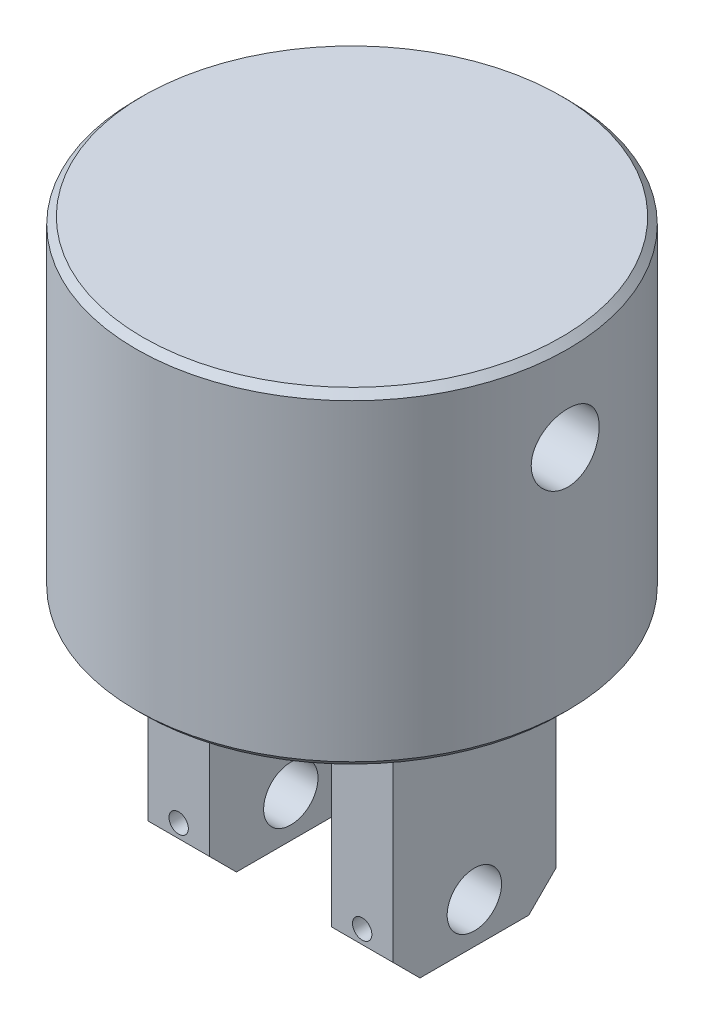
ISO-10303-21;
HEADER;
FILE_DESCRIPTION(('STEP AP214'),'2;1');
FILE_NAME('part.step','',(''),(''),'','','');
FILE_SCHEMA(('AUTOMOTIVE_DESIGN { 1 0 10303 214 1 1 1 1 }'));
ENDSEC;
DATA;
#1=APPLICATION_CONTEXT('core data for automotive mechanical design processes');
#2=APPLICATION_PROTOCOL_DEFINITION('international standard','automotive_design',2000,#1);
#3=PRODUCT_CONTEXT('',#1,'mechanical');
#4=PRODUCT('Part','Part','',(#3));
#5=PRODUCT_RELATED_PRODUCT_CATEGORY('part','',(#4));
#6=PRODUCT_DEFINITION_FORMATION('','',#4);
#7=PRODUCT_DEFINITION_CONTEXT('part definition',#1,'design');
#8=PRODUCT_DEFINITION('design','',#6,#7);
#9=PRODUCT_DEFINITION_SHAPE('','',#8);
#10=(LENGTH_UNIT() NAMED_UNIT(*) SI_UNIT(.MILLI.,.METRE.));
#11=(NAMED_UNIT(*) PLANE_ANGLE_UNIT() SI_UNIT($,.RADIAN.));
#12=(NAMED_UNIT(*) SI_UNIT($,.STERADIAN.) SOLID_ANGLE_UNIT());
#13=UNCERTAINTY_MEASURE_WITH_UNIT(LENGTH_MEASURE(1.E-05),#10,'distance_accuracy_value','');
#14=(GEOMETRIC_REPRESENTATION_CONTEXT(3) GLOBAL_UNCERTAINTY_ASSIGNED_CONTEXT((#13)) GLOBAL_UNIT_ASSIGNED_CONTEXT((#10,
#11,#12)) REPRESENTATION_CONTEXT('',''));
#15=CARTESIAN_POINT('',(0.,0.,0.));
#16=DIRECTION('',(0.,0.,1.));
#17=DIRECTION('',(1.,0.,0.));
#18=AXIS2_PLACEMENT_3D('',#15,#16,#17);
#19=CARTESIAN_POINT('',(-7.14375,15.875,19.05));
#20=DIRECTION('',(0.,1.,0.));
#21=DIRECTION('',(0.,0.,1.));
#22=AXIS2_PLACEMENT_3D('',#19,#20,#21);
#23=PLANE('',#22);
#24=DIRECTION('',(1.,0.,0.));
#25=VECTOR('',#24,1.);
#26=CARTESIAN_POINT('',(-7.14375,15.875,0.));
#27=LINE('',#26,#25);
#28=CARTESIAN_POINT('',(-7.14375,15.875,0.));
#29=VERTEX_POINT('',#28);
#30=CARTESIAN_POINT('',(7.14375,15.875,0.));
#31=VERTEX_POINT('',#30);
#32=EDGE_CURVE('E368',#29,#31,#27,.T.);
#33=ORIENTED_EDGE('',*,*,#32,.T.);
#34=DIRECTION('',(0.,0.,-1.));
#35=VECTOR('',#34,1.);
#36=CARTESIAN_POINT('',(7.14375,15.875,19.05));
#37=LINE('',#36,#35);
#38=CARTESIAN_POINT('',(7.14375,15.875,19.05));
#39=VERTEX_POINT('',#38);
#40=EDGE_CURVE('E295',#39,#31,#37,.T.);
#41=ORIENTED_EDGE('',*,*,#40,.F.);
#42=DIRECTION('',(1.,0.,0.));
#43=VECTOR('',#42,1.);
#44=CARTESIAN_POINT('',(-7.14375,15.875,19.05));
#45=LINE('',#44,#43);
#46=CARTESIAN_POINT('',(-7.14375,15.875,19.05));
#47=VERTEX_POINT('',#46);
#48=EDGE_CURVE('E381',#47,#39,#45,.T.);
#49=ORIENTED_EDGE('',*,*,#48,.F.);
#50=DIRECTION('',(0.,0.,-1.));
#51=VECTOR('',#50,1.);
#52=CARTESIAN_POINT('',(-7.14375,15.875,19.05));
#53=LINE('',#52,#51);
#54=EDGE_CURVE('E348',#47,#29,#53,.T.);
#55=ORIENTED_EDGE('',*,*,#54,.T.);
#56=EDGE_LOOP('',(#33,#41,#49,#55));
#57=FACE_BOUND('',#56,.T.);
#58=ADVANCED_FACE('F49',(#57),#23,.F.);
#59=CARTESIAN_POINT('',(7.14375,15.875,19.05));
#60=DIRECTION('',(1.,0.,0.));
#61=DIRECTION('',(0.,1.,0.));
#62=AXIS2_PLACEMENT_3D('',#59,#60,#61);
#63=PLANE('',#62);
#64=CARTESIAN_POINT('',(7.14374999999999,0.,9.525));
#65=DIRECTION('',(1.,0.,0.));
#66=DIRECTION('',(0.,1.,0.));
#67=AXIS2_PLACEMENT_3D('',#64,#65,#66);
#68=CIRCLE('',#67,3.175);
#69=CARTESIAN_POINT('',(7.14374999999999,3.175,9.525));
#70=VERTEX_POINT('',#69);
#71=EDGE_CURVE('E364',#70,#70,#68,.T.);
#72=ORIENTED_EDGE('',*,*,#71,.T.);
#73=EDGE_LOOP('',(#72));
#74=FACE_BOUND('',#73,.T.);
#75=DIRECTION('',(0.,-1.,0.));
#76=VECTOR('',#75,1.);
#77=CARTESIAN_POINT('',(7.14375,15.875,0.));
#78=LINE('',#77,#76);
#79=CARTESIAN_POINT('',(7.14375,-1.58749999999999,0.));
#80=VERTEX_POINT('',#79);
#81=EDGE_CURVE('E392',#31,#80,#78,.T.);
#82=ORIENTED_EDGE('',*,*,#81,.T.);
#83=DIRECTION('',(0.,-0.707106781186549,0.707106781186546));
#84=VECTOR('',#83,1.);
#85=CARTESIAN_POINT('',(7.14375,-4.7625,3.175));
#86=LINE('',#85,#84);
#87=CARTESIAN_POINT('',(7.14375,-4.7625,3.175));
#88=VERTEX_POINT('',#87);
#89=EDGE_CURVE('E300',#80,#88,#86,.T.);
#90=ORIENTED_EDGE('',*,*,#89,.T.);
#91=DIRECTION('',(0.,0.,-1.));
#92=VECTOR('',#91,1.);
#93=CARTESIAN_POINT('',(7.14375,-4.7625,19.05));
#94=LINE('',#93,#92);
#95=CARTESIAN_POINT('',(7.14375,-4.7625,15.875));
#96=VERTEX_POINT('',#95);
#97=EDGE_CURVE('E286',#96,#88,#94,.T.);
#98=ORIENTED_EDGE('',*,*,#97,.F.);
#99=DIRECTION('',(0.,-0.707106781186546,-0.707106781186549));
#100=VECTOR('',#99,1.);
#101=CARTESIAN_POINT('',(7.14375,-1.5875,19.05));
#102=LINE('',#101,#100);
#103=CARTESIAN_POINT('',(7.14375,-1.5875,19.05));
#104=VERTEX_POINT('',#103);
#105=EDGE_CURVE('E313',#96,#104,#102,.F.);
#106=ORIENTED_EDGE('',*,*,#105,.T.);
#107=DIRECTION('',(0.,-1.,0.));
#108=VECTOR('',#107,1.);
#109=CARTESIAN_POINT('',(7.14375,15.875,19.05));
#110=LINE('',#109,#108);
#111=EDGE_CURVE('E384',#39,#104,#110,.T.);
#112=ORIENTED_EDGE('',*,*,#111,.F.);
#113=ORIENTED_EDGE('',*,*,#40,.T.);
#114=EDGE_LOOP('',(#82,#90,#98,#106,#112,#113));
#115=FACE_BOUND('',#114,.T.);
#116=ADVANCED_FACE('F181',(#74,#115),#63,.F.);
#117=CARTESIAN_POINT('',(7.14375,-4.7625,19.05));
#118=DIRECTION('',(0.,1.,0.));
#119=DIRECTION('',(-1.,0.,0.));
#120=AXIS2_PLACEMENT_3D('',#117,#118,#119);
#121=PLANE('',#120);
#122=ORIENTED_EDGE('',*,*,#97,.T.);
#123=DIRECTION('',(1.,0.,0.));
#124=VECTOR('',#123,1.);
#125=CARTESIAN_POINT('',(14.2875,-4.7625,3.175));
#126=LINE('',#125,#124);
#127=CARTESIAN_POINT('',(14.2875,-4.7625,3.175));
#128=VERTEX_POINT('',#127);
#129=EDGE_CURVE('E289',#88,#128,#126,.T.);
#130=ORIENTED_EDGE('',*,*,#129,.T.);
#131=DIRECTION('',(0.,0.,-1.));
#132=VECTOR('',#131,1.);
#133=CARTESIAN_POINT('',(14.2875,-4.7625,19.05));
#134=LINE('',#133,#132);
#135=CARTESIAN_POINT('',(14.2875,-4.7625,15.875));
#136=VERTEX_POINT('',#135);
#137=EDGE_CURVE('E296',#136,#128,#134,.T.);
#138=ORIENTED_EDGE('',*,*,#137,.F.);
#139=DIRECTION('',(-1.,0.,0.));
#140=VECTOR('',#139,1.);
#141=CARTESIAN_POINT('',(7.14375,-4.7625,15.875));
#142=LINE('',#141,#140);
#143=EDGE_CURVE('E292',#136,#96,#142,.T.);
#144=ORIENTED_EDGE('',*,*,#143,.T.);
#145=EDGE_LOOP('',(#122,#130,#138,#144));
#146=FACE_BOUND('',#145,.T.);
#147=ADVANCED_FACE('F187',(#146),#121,.F.);
#148=CARTESIAN_POINT('',(14.2875,-4.7625,19.05));
#149=DIRECTION('',(-1.,0.,0.));
#150=DIRECTION('',(0.,-1.,0.));
#151=AXIS2_PLACEMENT_3D('',#148,#149,#150);
#152=PLANE('',#151);
#153=CARTESIAN_POINT('',(14.2875,0.,9.525));
#154=DIRECTION('',(1.,0.,0.));
#155=DIRECTION('',(0.,0.,-1.));
#156=AXIS2_PLACEMENT_3D('',#153,#154,#155);
#157=CIRCLE('',#156,3.175);
#158=CARTESIAN_POINT('',(14.2875,0.,6.35));
#159=VERTEX_POINT('',#158);
#160=EDGE_CURVE('E371',#159,#159,#157,.T.);
#161=ORIENTED_EDGE('',*,*,#160,.F.);
#162=EDGE_LOOP('',(#161));
#163=FACE_BOUND('',#162,.T.);
#164=ORIENTED_EDGE('',*,*,#137,.T.);
#165=DIRECTION('',(0.,0.707106781186549,-0.707106781186546));
#166=VECTOR('',#165,1.);
#167=CARTESIAN_POINT('',(14.2875,-4.7625,3.175));
#168=LINE('',#167,#166);
#169=CARTESIAN_POINT('',(14.2875,-1.58749999999999,0.));
#170=VERTEX_POINT('',#169);
#171=EDGE_CURVE('E301',#128,#170,#168,.T.);
#172=ORIENTED_EDGE('',*,*,#171,.T.);
#173=DIRECTION('',(0.,1.,0.));
#174=VECTOR('',#173,1.);
#175=CARTESIAN_POINT('',(14.2875,-4.7625,0.));
#176=LINE('',#175,#174);
#177=CARTESIAN_POINT('',(14.2875,23.8125,0.));
#178=VERTEX_POINT('',#177);
#179=EDGE_CURVE('E395',#170,#178,#176,.T.);
#180=ORIENTED_EDGE('',*,*,#179,.T.);
#181=DIRECTION('',(0.,0.,-1.));
#182=VECTOR('',#181,1.);
#183=CARTESIAN_POINT('',(14.2875,23.8125,19.05));
#184=LINE('',#183,#182);
#185=CARTESIAN_POINT('',(14.2875,23.8125,19.05));
#186=VERTEX_POINT('',#185);
#187=EDGE_CURVE('E357',#186,#178,#184,.T.);
#188=ORIENTED_EDGE('',*,*,#187,.F.);
#189=DIRECTION('',(0.,1.,0.));
#190=VECTOR('',#189,1.);
#191=CARTESIAN_POINT('',(14.2875,-4.7625,19.05));
#192=LINE('',#191,#190);
#193=CARTESIAN_POINT('',(14.2875,-1.5875,19.05));
#194=VERTEX_POINT('',#193);
#195=EDGE_CURVE('E387',#194,#186,#192,.T.);
#196=ORIENTED_EDGE('',*,*,#195,.F.);
#197=DIRECTION('',(0.,0.707106781186546,0.707106781186549));
#198=VECTOR('',#197,1.);
#199=CARTESIAN_POINT('',(14.2875,-1.5875,19.05));
#200=LINE('',#199,#198);
#201=EDGE_CURVE('E302',#194,#136,#200,.F.);
#202=ORIENTED_EDGE('',*,*,#201,.T.);
#203=EDGE_LOOP('',(#164,#172,#180,#188,#196,#202));
#204=FACE_BOUND('',#203,.T.);
#205=ADVANCED_FACE('F275',(#163,#204),#152,.F.);
#206=CARTESIAN_POINT('',(-14.2875,-4.7625,19.05));
#207=DIRECTION('',(1.,0.,0.));
#208=DIRECTION('',(0.,1.,0.));
#209=AXIS2_PLACEMENT_3D('',#206,#207,#208);
#210=PLANE('',#209);
#211=CARTESIAN_POINT('',(-14.2875,0.,9.525));
#212=DIRECTION('',(1.,0.,0.));
#213=DIRECTION('',(0.,0.,-1.));
#214=AXIS2_PLACEMENT_3D('',#211,#212,#213);
#215=CIRCLE('',#214,3.175);
#216=CARTESIAN_POINT('',(-14.2875,0.,6.35));
#217=VERTEX_POINT('',#216);
#218=EDGE_CURVE('E365',#217,#217,#215,.T.);
#219=ORIENTED_EDGE('',*,*,#218,.T.);
#220=EDGE_LOOP('',(#219));
#221=FACE_BOUND('',#220,.T.);
#222=DIRECTION('',(0.,-1.,0.));
#223=VECTOR('',#222,1.);
#224=CARTESIAN_POINT('',(-14.2875,-4.7625,0.));
#225=LINE('',#224,#223);
#226=CARTESIAN_POINT('',(-14.2875,23.8125,0.));
#227=VERTEX_POINT('',#226);
#228=CARTESIAN_POINT('',(-14.2875,-1.58749999999999,0.));
#229=VERTEX_POINT('',#228);
#230=EDGE_CURVE('E401',#227,#229,#225,.T.);
#231=ORIENTED_EDGE('',*,*,#230,.T.);
#232=DIRECTION('',(0.,-0.707106781186549,0.707106781186546));
#233=VECTOR('',#232,1.);
#234=CARTESIAN_POINT('',(-14.2875,-4.7625,3.175));
#235=LINE('',#234,#233);
#236=CARTESIAN_POINT('',(-14.2875,-4.7625,3.175));
#237=VERTEX_POINT('',#236);
#238=EDGE_CURVE('E68',#229,#237,#235,.T.);
#239=ORIENTED_EDGE('',*,*,#238,.T.);
#240=DIRECTION('',(0.,0.,-1.));
#241=VECTOR('',#240,1.);
#242=CARTESIAN_POINT('',(-14.2875,-4.7625,19.05));
#243=LINE('',#242,#241);
#244=CARTESIAN_POINT('',(-14.2875,-4.7625,15.875));
#245=VERTEX_POINT('',#244);
#246=EDGE_CURVE('E334',#245,#237,#243,.T.);
#247=ORIENTED_EDGE('',*,*,#246,.F.);
#248=DIRECTION('',(0.,-0.707106781186546,-0.707106781186549));
#249=VECTOR('',#248,1.);
#250=CARTESIAN_POINT('',(-14.2875,-1.5875,19.05));
#251=LINE('',#250,#249);
#252=CARTESIAN_POINT('',(-14.2875,-1.5875,19.05));
#253=VERTEX_POINT('',#252);
#254=EDGE_CURVE('E233',#245,#253,#251,.F.);
#255=ORIENTED_EDGE('',*,*,#254,.T.);
#256=DIRECTION('',(0.,-1.,0.));
#257=VECTOR('',#256,1.);
#258=CARTESIAN_POINT('',(-14.2875,-4.7625,19.05));
#259=LINE('',#258,#257);
#260=CARTESIAN_POINT('',(-14.2875,23.8125,19.05));
#261=VERTEX_POINT('',#260);
#262=EDGE_CURVE('E332',#261,#253,#259,.T.);
#263=ORIENTED_EDGE('',*,*,#262,.F.);
#264=DIRECTION('',(0.,0.,-1.));
#265=VECTOR('',#264,1.);
#266=CARTESIAN_POINT('',(-14.2875,23.8125,19.05));
#267=LINE('',#266,#265);
#268=EDGE_CURVE('E350',#261,#227,#267,.T.);
#269=ORIENTED_EDGE('',*,*,#268,.T.);
#270=EDGE_LOOP('',(#231,#239,#247,#255,#263,#269));
#271=FACE_BOUND('',#270,.T.);
#272=ADVANCED_FACE('F272',(#221,#271),#210,.F.);
#273=CARTESIAN_POINT('',(-7.14375,-4.7625,19.05));
#274=DIRECTION('',(0.,1.,0.));
#275=DIRECTION('',(-1.,0.,0.));
#276=AXIS2_PLACEMENT_3D('',#273,#274,#275);
#277=PLANE('',#276);
#278=ORIENTED_EDGE('',*,*,#246,.T.);
#279=DIRECTION('',(1.,0.,0.));
#280=VECTOR('',#279,1.);
#281=CARTESIAN_POINT('',(-7.14375,-4.7625,3.175));
#282=LINE('',#281,#280);
#283=CARTESIAN_POINT('',(-7.14375,-4.7625,3.175));
#284=VERTEX_POINT('',#283);
#285=EDGE_CURVE('E323',#237,#284,#282,.T.);
#286=ORIENTED_EDGE('',*,*,#285,.T.);
#287=DIRECTION('',(0.,0.,-1.));
#288=VECTOR('',#287,1.);
#289=CARTESIAN_POINT('',(-7.14375,-4.7625,19.05));
#290=LINE('',#289,#288);
#291=CARTESIAN_POINT('',(-7.14375,-4.7625,15.875));
#292=VERTEX_POINT('',#291);
#293=EDGE_CURVE('E345',#292,#284,#290,.T.);
#294=ORIENTED_EDGE('',*,*,#293,.F.);
#295=DIRECTION('',(-1.,0.,0.));
#296=VECTOR('',#295,1.);
#297=CARTESIAN_POINT('',(-7.14375,-4.7625,15.875));
#298=LINE('',#297,#296);
#299=EDGE_CURVE('E75',#292,#245,#298,.T.);
#300=ORIENTED_EDGE('',*,*,#299,.T.);
#301=EDGE_LOOP('',(#278,#286,#294,#300));
#302=FACE_BOUND('',#301,.T.);
#303=ADVANCED_FACE('F268',(#302),#277,.F.);
#304=CARTESIAN_POINT('',(-7.14375,15.875,19.05));
#305=DIRECTION('',(-1.,0.,0.));
#306=DIRECTION('',(0.,-1.,0.));
#307=AXIS2_PLACEMENT_3D('',#304,#305,#306);
#308=PLANE('',#307);
#309=CARTESIAN_POINT('',(-7.14375,0.,9.525));
#310=DIRECTION('',(-1.,0.,0.));
#311=DIRECTION('',(0.,-1.,0.));
#312=AXIS2_PLACEMENT_3D('',#309,#310,#311);
#313=CIRCLE('',#312,3.175);
#314=CARTESIAN_POINT('',(-7.14375,-3.175,9.525));
#315=VERTEX_POINT('',#314);
#316=EDGE_CURVE('E362',#315,#315,#313,.T.);
#317=ORIENTED_EDGE('',*,*,#316,.T.);
#318=EDGE_LOOP('',(#317));
#319=FACE_BOUND('',#318,.T.);
#320=ORIENTED_EDGE('',*,*,#293,.T.);
#321=DIRECTION('',(0.,0.707106781186549,-0.707106781186546));
#322=VECTOR('',#321,1.);
#323=CARTESIAN_POINT('',(-7.14375,-4.7625,3.175));
#324=LINE('',#323,#322);
#325=CARTESIAN_POINT('',(-7.14375,-1.58749999999999,0.));
#326=VERTEX_POINT('',#325);
#327=EDGE_CURVE('E328',#284,#326,#324,.T.);
#328=ORIENTED_EDGE('',*,*,#327,.T.);
#329=DIRECTION('',(0.,1.,0.));
#330=VECTOR('',#329,1.);
#331=CARTESIAN_POINT('',(-7.14375,15.875,0.));
#332=LINE('',#331,#330);
#333=EDGE_CURVE('E385',#326,#29,#332,.T.);
#334=ORIENTED_EDGE('',*,*,#333,.T.);
#335=ORIENTED_EDGE('',*,*,#54,.F.);
#336=DIRECTION('',(0.,1.,0.));
#337=VECTOR('',#336,1.);
#338=CARTESIAN_POINT('',(-7.14375,15.875,19.05));
#339=LINE('',#338,#337);
#340=CARTESIAN_POINT('',(-7.14375,-1.5875,19.05));
#341=VERTEX_POINT('',#340);
#342=EDGE_CURVE('E341',#341,#47,#339,.T.);
#343=ORIENTED_EDGE('',*,*,#342,.F.);
#344=DIRECTION('',(0.,0.707106781186546,0.707106781186549));
#345=VECTOR('',#344,1.);
#346=CARTESIAN_POINT('',(-7.14375,-1.5875,19.05));
#347=LINE('',#346,#345);
#348=EDGE_CURVE('E326',#341,#292,#347,.F.);
#349=ORIENTED_EDGE('',*,*,#348,.T.);
#350=EDGE_LOOP('',(#320,#328,#334,#335,#343,#349));
#351=FACE_BOUND('',#350,.T.);
#352=ADVANCED_FACE('F261',(#319,#351),#308,.F.);
#353=CARTESIAN_POINT('',(0.,0.,19.05));
#354=DIRECTION('',(0.,0.,-1.));
#355=DIRECTION('',(-1.,0.,0.));
#356=AXIS2_PLACEMENT_3D('',#353,#354,#355);
#357=PLANE('',#356);
#358=CARTESIAN_POINT('',(-10.715625,0.,19.05));
#359=DIRECTION('',(0.,0.,1.));
#360=DIRECTION('',(1.,0.,0.));
#361=AXIS2_PLACEMENT_3D('',#358,#359,#360);
#362=CIRCLE('',#361,1.1303);
#363=CARTESIAN_POINT('',(-9.585325,0.,19.05));
#364=VERTEX_POINT('',#363);
#365=EDGE_CURVE('E154',#364,#364,#362,.T.);
#366=ORIENTED_EDGE('',*,*,#365,.F.);
#367=EDGE_LOOP('',(#366));
#368=FACE_BOUND('',#367,.T.);
#369=CARTESIAN_POINT('',(10.715625,0.,19.05));
#370=DIRECTION('',(0.,0.,1.));
#371=DIRECTION('',(1.,0.,0.));
#372=AXIS2_PLACEMENT_3D('',#369,#370,#371);
#373=CIRCLE('',#372,1.1303);
#374=CARTESIAN_POINT('',(11.845925,0.,19.05));
#375=VERTEX_POINT('',#374);
#376=EDGE_CURVE('E166',#375,#375,#373,.T.);
#377=ORIENTED_EDGE('',*,*,#376,.F.);
#378=EDGE_LOOP('',(#377));
#379=FACE_BOUND('',#378,.T.);
#380=ORIENTED_EDGE('',*,*,#111,.T.);
#381=DIRECTION('',(1.,0.,0.));
#382=VECTOR('',#381,1.);
#383=CARTESIAN_POINT('',(0.,-1.5875,19.05));
#384=LINE('',#383,#382);
#385=EDGE_CURVE('E319',#104,#194,#384,.T.);
#386=ORIENTED_EDGE('',*,*,#385,.T.);
#387=ORIENTED_EDGE('',*,*,#195,.T.);
#388=DIRECTION('',(-1.,0.,0.));
#389=VECTOR('',#388,1.);
#390=CARTESIAN_POINT('',(-14.2875,23.8125,19.05));
#391=LINE('',#390,#389);
#392=EDGE_CURVE('E340',#186,#261,#391,.T.);
#393=ORIENTED_EDGE('',*,*,#392,.T.);
#394=ORIENTED_EDGE('',*,*,#262,.T.);
#395=DIRECTION('',(1.,0.,0.));
#396=VECTOR('',#395,1.);
#397=CARTESIAN_POINT('',(0.,-1.5875,19.05));
#398=LINE('',#397,#396);
#399=EDGE_CURVE('E316',#253,#341,#398,.T.);
#400=ORIENTED_EDGE('',*,*,#399,.T.);
#401=ORIENTED_EDGE('',*,*,#342,.T.);
#402=ORIENTED_EDGE('',*,*,#48,.T.);
#403=EDGE_LOOP('',(#380,#386,#387,#393,#394,#400,#401,#402));
#404=FACE_BOUND('',#403,.T.);
#405=ADVANCED_FACE('F257',(#368,#379,#404),#357,.F.);
#406=CARTESIAN_POINT('',(0.,0.,0.));
#407=DIRECTION('',(0.,0.,-1.));
#408=DIRECTION('',(-1.,0.,0.));
#409=AXIS2_PLACEMENT_3D('',#406,#407,#408);
#410=PLANE('',#409);
#411=ORIENTED_EDGE('',*,*,#179,.F.);
#412=DIRECTION('',(-1.,0.,0.));
#413=VECTOR('',#412,1.);
#414=CARTESIAN_POINT('',(7.14375,-1.58749999999999,0.));
#415=LINE('',#414,#413);
#416=EDGE_CURVE('E311',#170,#80,#415,.T.);
#417=ORIENTED_EDGE('',*,*,#416,.T.);
#418=ORIENTED_EDGE('',*,*,#81,.F.);
#419=ORIENTED_EDGE('',*,*,#32,.F.);
#420=ORIENTED_EDGE('',*,*,#333,.F.);
#421=DIRECTION('',(-1.,0.,0.));
#422=VECTOR('',#421,1.);
#423=CARTESIAN_POINT('',(-14.2875,-1.58749999999999,0.));
#424=LINE('',#423,#422);
#425=EDGE_CURVE('E309',#326,#229,#424,.T.);
#426=ORIENTED_EDGE('',*,*,#425,.T.);
#427=ORIENTED_EDGE('',*,*,#230,.F.);
#428=DIRECTION('',(-1.,0.,0.));
#429=VECTOR('',#428,1.);
#430=CARTESIAN_POINT('',(-14.2875,23.8125,0.));
#431=LINE('',#430,#429);
#432=EDGE_CURVE('E398',#178,#227,#431,.T.);
#433=ORIENTED_EDGE('',*,*,#432,.F.);
#434=EDGE_LOOP('',(#411,#417,#418,#419,#420,#426,#427,#433));
#435=FACE_BOUND('',#434,.T.);
#436=ADVANCED_FACE('F260',(#435),#410,.T.);
#437=CARTESIAN_POINT('',(-14.2875,0.,9.525));
#438=DIRECTION('',(1.,0.,0.));
#439=DIRECTION('',(0.,0.,-1.));
#440=AXIS2_PLACEMENT_3D('',#437,#438,#439);
#441=CYLINDRICAL_SURFACE('',#440,3.175);
#442=CARTESIAN_POINT('',(-9.585325,0.,12.7));
#443=CARTESIAN_POINT('',(-9.58532377624257,0.0614285544766762,12.7000008764908));
#444=CARTESIAN_POINT('',(-9.59034867898313,0.122848391480886,12.6982013007014));
#445=CARTESIAN_POINT('',(-9.61024358543575,0.243864611742383,12.6912010034201));
#446=CARTESIAN_POINT('',(-9.62511328045996,0.303461052111786,12.6860003885692));
#447=CARTESIAN_POINT('',(-9.66411344997215,0.419068309151045,12.6727594989374));
#448=CARTESIAN_POINT('',(-9.68822716174167,0.475085403185974,12.6647243662461));
#449=CARTESIAN_POINT('',(-9.7449500401224,0.582278041616503,12.6466239348706));
#450=CARTESIAN_POINT('',(-9.77756122563317,0.63345243149865,12.6365581538567));
#451=CARTESIAN_POINT('',(-9.85168007992648,0.731495005230029,12.615007908556));
#452=CARTESIAN_POINT('',(-9.89345931689856,0.778149616243896,12.6034861058259));
#453=CARTESIAN_POINT('',(-9.98415154130837,0.863958107942657,12.580516031792));
#454=CARTESIAN_POINT('',(-10.0330664046313,0.903110009958689,12.569067780653));
#455=CARTESIAN_POINT('',(-10.138650690177,0.974093633832356,12.5471178598623));
#456=CARTESIAN_POINT('',(-10.1955255183333,1.00563502809097,12.5366609490419));
#457=CARTESIAN_POINT('',(-10.3142043975999,1.0586113470591,12.5184524473871));
#458=CARTESIAN_POINT('',(-10.3760066911635,1.08004985661479,12.5106998972079));
#459=CARTESIAN_POINT('',(-10.5003399448491,1.11138819305282,12.4991742173714));
#460=CARTESIAN_POINT('',(-10.5627556997839,1.12169236541681,12.4952621480518));
#461=CARTESIAN_POINT('',(-10.6885434785953,1.13173392893205,12.4914515837926));
#462=CARTESIAN_POINT('',(-10.7519151476816,1.13147514856466,12.4915516346829));
#463=CARTESIAN_POINT('',(-10.8742383661018,1.12070953557278,12.4956332824202));
#464=CARTESIAN_POINT('',(-10.9332459791138,1.11074743190181,12.4994085523292));
#465=CARTESIAN_POINT('',(-11.0486896424094,1.08175290027524,12.5100748398767));
#466=CARTESIAN_POINT('',(-11.1051253424596,1.06271924100948,12.5169662804762));
#467=CARTESIAN_POINT('',(-11.2149926232959,1.01579639288465,12.5332231181809));
#468=CARTESIAN_POINT('',(-11.2683534735373,0.987756625641374,12.5426300903932));
#469=CARTESIAN_POINT('',(-11.369777260726,0.923722187948484,12.5628425372258));
#470=CARTESIAN_POINT('',(-11.4178384948227,0.887724971743379,12.57364845894));
#471=CARTESIAN_POINT('',(-11.5103362249113,0.806247147627665,12.5962342285018));
#472=CARTESIAN_POINT('',(-11.5543813554331,0.76032665348544,12.6080335809407));
#473=CARTESIAN_POINT('',(-11.634255406903,0.661610098844967,12.6307139394894));
#474=CARTESIAN_POINT('',(-11.670083302353,0.60881318146775,12.6415948308697));
#475=CARTESIAN_POINT('',(-11.7328814387664,0.49692365049042,12.6613921717345));
#476=CARTESIAN_POINT('',(-11.7597333627379,0.437759573781157,12.6702819072522));
#477=CARTESIAN_POINT('',(-11.8029770019204,0.315359989841961,12.6848993692858));
#478=CARTESIAN_POINT('',(-11.8193728855383,0.252126116160288,12.6906283557433));
#479=CARTESIAN_POINT('',(-11.8405144892903,0.126684885961714,12.6980632987933));
#480=CARTESIAN_POINT('',(-11.8457880443381,0.0645771816882154,12.69995136825));
#481=CARTESIAN_POINT('',(-11.8460566004233,-0.0596565359676976,12.7000467253115));
#482=CARTESIAN_POINT('',(-11.8410536184374,-0.121782543364873,12.6982547352019));
#483=CARTESIAN_POINT('',(-11.8213205525576,-0.242087689559502,12.6913116875283));
#484=CARTESIAN_POINT('',(-11.8069259768773,-0.300329231110412,12.6862765651754));
#485=CARTESIAN_POINT('',(-11.76924958393,-0.4135381928465,12.6734693332048));
#486=CARTESIAN_POINT('',(-11.7459666132622,-0.468505187040128,12.6656968683865));
#487=CARTESIAN_POINT('',(-11.6904560976323,-0.575332725471093,12.6479206805735));
#488=CARTESIAN_POINT('',(-11.657995399821,-0.627062417893484,12.6378603506693));
#489=CARTESIAN_POINT('',(-11.5853189262578,-0.724505279210263,12.6166351778224));
#490=CARTESIAN_POINT('',(-11.5451005035322,-0.770216385550684,12.605469958521));
#491=CARTESIAN_POINT('',(-11.455576586359,-0.856811848575501,12.5825496331488));
#492=CARTESIAN_POINT('',(-11.4059066248848,-0.897320261231921,12.5707941243994));
#493=CARTESIAN_POINT('',(-11.3002308873437,-0.969488296473176,12.5485984159885));
#494=CARTESIAN_POINT('',(-11.244224816642,-1.00114750732455,12.5381582775406));
#495=CARTESIAN_POINT('',(-11.1272322630919,-1.0546547707943,12.5198511267704));
#496=CARTESIAN_POINT('',(-11.0662413841875,-1.07649405053024,12.5119864169694));
#497=CARTESIAN_POINT('',(-10.9410953660597,-1.1094694490286,12.4998978130343));
#498=CARTESIAN_POINT('',(-10.8769419460346,-1.1206113170349,12.4956719633481));
#499=CARTESIAN_POINT('',(-10.7513193439522,-1.13139068963521,12.4915822204435));
#500=CARTESIAN_POINT('',(-10.6899117595238,-1.13166111008653,12.4914783574786));
#501=CARTESIAN_POINT('',(-10.5679761176456,-1.12228164306422,12.4950393141538));
#502=CARTESIAN_POINT('',(-10.5074479929935,-1.11263251765991,12.498703844287));
#503=CARTESIAN_POINT('',(-10.3904979488075,-1.08416089230555,12.5091983947589));
#504=CARTESIAN_POINT('',(-10.3340114686856,-1.06557142470547,12.5159477964968));
#505=CARTESIAN_POINT('',(-10.224920407676,-1.01994372799954,12.5318123311106));
#506=CARTESIAN_POINT('',(-10.1723167614023,-0.992903472899548,12.5409280311946));
#507=CARTESIAN_POINT('',(-10.0697155113246,-0.929616151238463,12.5610485427246));
#508=CARTESIAN_POINT('',(-10.0199679511517,-0.892986233526777,12.5721235224069));
#509=CARTESIAN_POINT('',(-9.92712229256409,-0.812177154252538,12.5946499587474));
#510=CARTESIAN_POINT('',(-9.88402620582446,-0.767995717285479,12.6061015280364));
#511=CARTESIAN_POINT('',(-9.80366142120086,-0.670861718733731,12.6287342857657));
#512=CARTESIAN_POINT('',(-9.76675966782598,-0.61759551549228,12.6398777615714));
#513=CARTESIAN_POINT('',(-9.70245951178946,-0.505234578584049,12.6600624446088));
#514=CARTESIAN_POINT('',(-9.67506030221262,-0.446140340356567,12.6691038303194));
#515=CARTESIAN_POINT('',(-9.63069149917454,-0.323645197027852,12.6840644382611));
#516=CARTESIAN_POINT('',(-9.61374043486654,-0.260236860921378,12.6899781110627));
#517=CARTESIAN_POINT('',(-9.59105999228507,-0.131215131612623,12.6979446829944));
#518=CARTESIAN_POINT('',(-9.58532630691115,-0.0656025945972266,12.6999990639521));
#519=CARTESIAN_POINT('',(-9.585325,0.,12.7));
#520=B_SPLINE_CURVE_WITH_KNOTS('',3,(#442,#443,#444,#445,#446,#447,#448,#449,#450,#451,#452,
#453,#454,#455,#456,#457,#458,#459,#460,#461,#462,#463,#464,#465,#466,#467,#468,#469,#470,#471,
#472,#473,#474,#475,#476,#477,#478,#479,#480,#481,#482,#483,#484,#485,#486,#487,#488,#489,#490,
#491,#492,#493,#494,#495,#496,#497,#498,#499,#500,#501,#502,#503,#504,#505,#506,#507,#508,#509,
#510,#511,#512,#513,#514,#515,#516,#517,#518,#519),.UNSPECIFIED.,.T.,.F.,(4,2,2,2,2,2,2,2,2,2,2,
2,2,2,2,2,2,2,2,2,2,2,2,2,2,2,2,2,2,2,2,2,2,2,2,2,2,2,4),(0.,0.18404394145956,0.368082112412805,
0.551788122807081,0.735537819443365,0.925722644883204,1.11595755842548,1.31258758821648,
1.50914779437035,1.69830149435247,1.88738663727476,2.06643452933681,2.24550673104465,
2.42774410221586,2.61003985955346,2.80329006106037,2.99656436677723,3.19229416831945,
3.3879458913255,3.57408187032768,3.7601813198999,3.93997181359128,4.11978564569259,
4.30465683345396,4.48959121210529,4.68416822385536,4.8787542873297,5.07351384543878,
5.26816867279116,5.45147357003618,5.63476438593104,5.81351722268549,5.99231294661076,
6.17977826003501,6.36730015993202,6.56359488860405,6.75987294468715,6.95649809396631,
7.15304773089829),.UNSPECIFIED.);
#521=CARTESIAN_POINT('',(-9.585325,0.,12.7));
#522=VERTEX_POINT('',#521);
#523=EDGE_CURVE('E157',#522,#522,#520,.T.);
#524=ORIENTED_EDGE('',*,*,#523,.T.);
#525=EDGE_LOOP('',(#524));
#526=FACE_BOUND('',#525,.T.);
#527=ORIENTED_EDGE('',*,*,#218,.F.);
#528=EDGE_LOOP('',(#527));
#529=FACE_BOUND('',#528,.T.);
#530=ORIENTED_EDGE('',*,*,#316,.F.);
#531=EDGE_LOOP('',(#530));
#532=FACE_BOUND('',#531,.T.);
#533=ADVANCED_FACE('F255',(#526,#529,#532),#441,.F.);
#534=CARTESIAN_POINT('',(11.845925,0.,12.7));
#535=CARTESIAN_POINT('',(11.8459262237574,0.0614285544766797,12.7000008764908));
#536=CARTESIAN_POINT('',(11.8409013210169,0.12284839148089,12.6982013007014));
#537=CARTESIAN_POINT('',(11.8210064145643,0.243864611742387,12.6912010034201));
#538=CARTESIAN_POINT('',(11.80613671954,0.303461052111789,12.6860003885692));
#539=CARTESIAN_POINT('',(11.7671365500278,0.419068309151049,12.6727594989374));
#540=CARTESIAN_POINT('',(11.7430228382583,0.475085403185977,12.6647243662461));
#541=CARTESIAN_POINT('',(11.6862999598776,0.582278041616507,12.6466239348706));
#542=CARTESIAN_POINT('',(11.6536887743668,0.633452431498654,12.6365581538567));
#543=CARTESIAN_POINT('',(11.5795699200735,0.731495005230033,12.615007908556));
#544=CARTESIAN_POINT('',(11.5377906831014,0.7781496162439,12.6034861058259));
#545=CARTESIAN_POINT('',(11.4470984586916,0.863958107942661,12.580516031792));
#546=CARTESIAN_POINT('',(11.3981835953687,0.903110009958693,12.569067780653));
#547=CARTESIAN_POINT('',(11.292599309823,0.974093633832359,12.5471178598623));
#548=CARTESIAN_POINT('',(11.2357244816667,1.00563502809097,12.5366609490419));
#549=CARTESIAN_POINT('',(11.1170456024001,1.0586113470591,12.5184524473871));
#550=CARTESIAN_POINT('',(11.0552433088365,1.08004985661479,12.5106998972079));
#551=CARTESIAN_POINT('',(10.9309100551509,1.11138819305283,12.4991742173714));
#552=CARTESIAN_POINT('',(10.8684943002161,1.12169236541681,12.4952621480518));
#553=CARTESIAN_POINT('',(10.7427065214047,1.13173392893205,12.4914515837926));
#554=CARTESIAN_POINT('',(10.6793348523184,1.13147514856467,12.4915516346829));
#555=CARTESIAN_POINT('',(10.5570116338982,1.12070953557278,12.4956332824202));
#556=CARTESIAN_POINT('',(10.4980040208862,1.11074743190182,12.4994085523292));
#557=CARTESIAN_POINT('',(10.3825603575906,1.08175290027525,12.5100748398767));
#558=CARTESIAN_POINT('',(10.3261246575404,1.06271924100948,12.5169662804762));
#559=CARTESIAN_POINT('',(10.216257376704,1.01579639288465,12.5332231181809));
#560=CARTESIAN_POINT('',(10.1628965264627,0.987756625641378,12.5426300903932));
#561=CARTESIAN_POINT('',(10.061472739274,0.923722187948489,12.5628425372258));
#562=CARTESIAN_POINT('',(10.0134115051773,0.887724971743384,12.57364845894));
#563=CARTESIAN_POINT('',(9.92091377508873,0.806247147627669,12.5962342285018));
#564=CARTESIAN_POINT('',(9.87686864456685,0.760326653485443,12.6080335809407));
#565=CARTESIAN_POINT('',(9.79699459309705,0.661610098844969,12.6307139394894));
#566=CARTESIAN_POINT('',(9.76116669764696,0.608813181467752,12.6415948308697));
#567=CARTESIAN_POINT('',(9.69836856123357,0.496923650490422,12.6613921717345));
#568=CARTESIAN_POINT('',(9.67151663726211,0.43775957378116,12.6702819072522));
#569=CARTESIAN_POINT('',(9.62827299807959,0.315359989841964,12.6848993692858));
#570=CARTESIAN_POINT('',(9.61187711446166,0.252126116160291,12.6906283557433));
#571=CARTESIAN_POINT('',(9.59073551070969,0.126684885961717,12.6980632987933));
#572=CARTESIAN_POINT('',(9.5854619556619,0.0645771816882184,12.69995136825));
#573=CARTESIAN_POINT('',(9.58519339957667,-0.0596565359676946,12.7000467253115));
#574=CARTESIAN_POINT('',(9.59019638156263,-0.121782543364871,12.6982547352019));
#575=CARTESIAN_POINT('',(9.60992944744243,-0.242087689559499,12.6913116875283));
#576=CARTESIAN_POINT('',(9.62432402312268,-0.300329231110408,12.6862765651754));
#577=CARTESIAN_POINT('',(9.66200041607003,-0.413538192846497,12.6734693332048));
#578=CARTESIAN_POINT('',(9.68528338673783,-0.468505187040125,12.6656968683866));
#579=CARTESIAN_POINT('',(9.74079390236775,-0.575332725471089,12.6479206805735));
#580=CARTESIAN_POINT('',(9.77325460017901,-0.627062417893481,12.6378603506693));
#581=CARTESIAN_POINT('',(9.84593107374224,-0.724505279210259,12.6166351778224));
#582=CARTESIAN_POINT('',(9.88614949646778,-0.770216385550681,12.605469958521));
#583=CARTESIAN_POINT('',(9.97567341364105,-0.856811848575497,12.5825496331488));
#584=CARTESIAN_POINT('',(10.0253433751152,-0.897320261231917,12.5707941243994));
#585=CARTESIAN_POINT('',(10.1310191126563,-0.969488296473172,12.5485984159885));
#586=CARTESIAN_POINT('',(10.187025183358,-1.00114750732455,12.5381582775406));
#587=CARTESIAN_POINT('',(10.3040177369081,-1.05465477079429,12.5198511267704));
#588=CARTESIAN_POINT('',(10.3650086158125,-1.07649405053023,12.5119864169694));
#589=CARTESIAN_POINT('',(10.4901546339403,-1.1094694490286,12.4998978130343));
#590=CARTESIAN_POINT('',(10.5543080539654,-1.12061131703489,12.4956719633481));
#591=CARTESIAN_POINT('',(10.6799306560478,-1.13139068963521,12.4915822204435));
#592=CARTESIAN_POINT('',(10.7413382404762,-1.13166111008653,12.4914783574786));
#593=CARTESIAN_POINT('',(10.8632738823544,-1.12228164306422,12.4950393141538));
#594=CARTESIAN_POINT('',(10.9238020070065,-1.11263251765991,12.498703844287));
#595=CARTESIAN_POINT('',(11.0407520511925,-1.08416089230555,12.5091983947589));
#596=CARTESIAN_POINT('',(11.0972385313144,-1.06557142470547,12.5159477964968));
#597=CARTESIAN_POINT('',(11.206329592324,-1.01994372799953,12.5318123311106));
#598=CARTESIAN_POINT('',(11.2589332385977,-0.992903472899545,12.5409280311946));
#599=CARTESIAN_POINT('',(11.3615344886754,-0.929616151238459,12.5610485427246));
#600=CARTESIAN_POINT('',(11.4112820488483,-0.892986233526773,12.5721235224069));
#601=CARTESIAN_POINT('',(11.5041277074359,-0.812177154252534,12.5946499587474));
#602=CARTESIAN_POINT('',(11.5472237941755,-0.767995717285475,12.6061015280364));
#603=CARTESIAN_POINT('',(11.6275885787991,-0.670861718733727,12.6287342857657));
#604=CARTESIAN_POINT('',(11.664490332174,-0.617595515492277,12.6398777615714));
#605=CARTESIAN_POINT('',(11.7287904882105,-0.505234578584045,12.6600624446088));
#606=CARTESIAN_POINT('',(11.7561896977874,-0.446140340356563,12.6691038303194));
#607=CARTESIAN_POINT('',(11.8005585008255,-0.323645197027848,12.6840644382611));
#608=CARTESIAN_POINT('',(11.8175095651335,-0.260236860921374,12.6899781110627));
#609=CARTESIAN_POINT('',(11.8401900077149,-0.131215131612619,12.6979446829944));
#610=CARTESIAN_POINT('',(11.8459236930889,-0.0656025945972228,12.6999990639521));
#611=CARTESIAN_POINT('',(11.845925,0.,12.7));
#612=B_SPLINE_CURVE_WITH_KNOTS('',3,(#534,#535,#536,#537,#538,#539,#540,#541,#542,#543,#544,
#545,#546,#547,#548,#549,#550,#551,#552,#553,#554,#555,#556,#557,#558,#559,#560,#561,#562,#563,
#564,#565,#566,#567,#568,#569,#570,#571,#572,#573,#574,#575,#576,#577,#578,#579,#580,#581,#582,
#583,#584,#585,#586,#587,#588,#589,#590,#591,#592,#593,#594,#595,#596,#597,#598,#599,#600,#601,
#602,#603,#604,#605,#606,#607,#608,#609,#610,#611),.UNSPECIFIED.,.T.,.F.,(4,2,2,2,2,2,2,2,2,2,2,
2,2,2,2,2,2,2,2,2,2,2,2,2,2,2,2,2,2,2,2,2,2,2,2,2,2,2,4),(0.,0.18404394145956,0.368082112412806,
0.551788122807081,0.735537819443366,0.925722644883205,1.11595755842549,1.31258758821648,
1.50914779437035,1.69830149435247,1.88738663727476,2.06643452933682,2.24550673104465,
2.42774410221586,2.61003985955346,2.80329006106037,2.99656436677724,3.19229416831945,
3.3879458913255,3.57408187032768,3.76018131989991,3.93997181359128,4.11978564569259,
4.30465683345396,4.48959121210529,4.68416822385536,4.8787542873297,5.07351384543878,
5.26816867279116,5.45147357003618,5.63476438593104,5.81351722268549,5.99231294661076,
6.17977826003501,6.36730015993202,6.56359488860405,6.75987294468715,6.95649809396631,
7.15304773089829),.UNSPECIFIED.);
#613=CARTESIAN_POINT('',(11.845925,0.,12.7));
#614=VERTEX_POINT('',#613);
#615=EDGE_CURVE('E375',#614,#614,#612,.T.);
#616=ORIENTED_EDGE('',*,*,#615,.T.);
#617=EDGE_LOOP('',(#616));
#618=FACE_BOUND('',#617,.T.);
#619=ORIENTED_EDGE('',*,*,#160,.T.);
#620=EDGE_LOOP('',(#619));
#621=FACE_BOUND('',#620,.T.);
#622=ORIENTED_EDGE('',*,*,#71,.F.);
#623=EDGE_LOOP('',(#622));
#624=FACE_BOUND('',#623,.T.);
#625=ADVANCED_FACE('F197',(#618,#621,#624),#441,.F.);
#626=CARTESIAN_POINT('',(7.14375,-4.7625,3.175));
#627=DIRECTION('',(0.,-0.707106781186546,-0.707106781186549));
#628=DIRECTION('',(-1.,0.,0.));
#629=AXIS2_PLACEMENT_3D('',#626,#627,#628);
#630=PLANE('',#629);
#631=ORIENTED_EDGE('',*,*,#89,.F.);
#632=ORIENTED_EDGE('',*,*,#416,.F.);
#633=ORIENTED_EDGE('',*,*,#171,.F.);
#634=ORIENTED_EDGE('',*,*,#129,.F.);
#635=EDGE_LOOP('',(#631,#632,#633,#634));
#636=FACE_BOUND('',#635,.T.);
#637=ADVANCED_FACE('F193',(#636),#630,.T.);
#638=CARTESIAN_POINT('',(0.,-1.5875,19.05));
#639=DIRECTION('',(0.,0.707106781186549,-0.707106781186546));
#640=DIRECTION('',(1.,0.,0.));
#641=AXIS2_PLACEMENT_3D('',#638,#639,#640);
#642=PLANE('',#641);
#643=ORIENTED_EDGE('',*,*,#105,.F.);
#644=ORIENTED_EDGE('',*,*,#143,.F.);
#645=ORIENTED_EDGE('',*,*,#201,.F.);
#646=ORIENTED_EDGE('',*,*,#385,.F.);
#647=EDGE_LOOP('',(#643,#644,#645,#646));
#648=FACE_BOUND('',#647,.T.);
#649=ADVANCED_FACE('F196',(#648),#642,.F.);
#650=CARTESIAN_POINT('',(-7.14375,-4.7625,3.175));
#651=DIRECTION('',(0.,-0.707106781186546,-0.707106781186549));
#652=DIRECTION('',(-1.,0.,0.));
#653=AXIS2_PLACEMENT_3D('',#650,#651,#652);
#654=PLANE('',#653);
#655=ORIENTED_EDGE('',*,*,#238,.F.);
#656=ORIENTED_EDGE('',*,*,#425,.F.);
#657=ORIENTED_EDGE('',*,*,#327,.F.);
#658=ORIENTED_EDGE('',*,*,#285,.F.);
#659=EDGE_LOOP('',(#655,#656,#657,#658));
#660=FACE_BOUND('',#659,.T.);
#661=ADVANCED_FACE('F201',(#660),#654,.T.);
#662=CARTESIAN_POINT('',(0.,-1.5875,19.05));
#663=DIRECTION('',(0.,0.707106781186549,-0.707106781186546));
#664=DIRECTION('',(1.,0.,0.));
#665=AXIS2_PLACEMENT_3D('',#662,#663,#664);
#666=PLANE('',#665);
#667=ORIENTED_EDGE('',*,*,#254,.F.);
#668=ORIENTED_EDGE('',*,*,#299,.F.);
#669=ORIENTED_EDGE('',*,*,#348,.F.);
#670=ORIENTED_EDGE('',*,*,#399,.F.);
#671=EDGE_LOOP('',(#667,#668,#669,#670));
#672=FACE_BOUND('',#671,.T.);
#673=ADVANCED_FACE('F205',(#672),#666,.F.);
#674=CARTESIAN_POINT('',(0.,23.8125,9.525));
#675=DIRECTION('',(0.,1.,0.));
#676=DIRECTION('',(0.,0.,1.));
#677=AXIS2_PLACEMENT_3D('',#674,#675,#676);
#678=PLANE('',#677);
#679=CARTESIAN_POINT('',(0.,23.8125,9.525));
#680=DIRECTION('',(0.,1.,0.));
#681=DIRECTION('',(0.,0.,1.));
#682=AXIS2_PLACEMENT_3D('',#679,#680,#681);
#683=CIRCLE('',#682,24.41575);
#684=CARTESIAN_POINT('',(0.,23.8125,33.94075));
#685=VERTEX_POINT('',#684);
#686=EDGE_CURVE('E61',#685,#685,#683,.F.);
#687=ORIENTED_EDGE('',*,*,#686,.T.);
#688=EDGE_LOOP('',(#687));
#689=FACE_BOUND('',#688,.T.);
#690=ORIENTED_EDGE('',*,*,#187,.T.);
#691=ORIENTED_EDGE('',*,*,#432,.T.);
#692=ORIENTED_EDGE('',*,*,#268,.F.);
#693=ORIENTED_EDGE('',*,*,#392,.F.);
#694=EDGE_LOOP('',(#690,#691,#692,#693));
#695=FACE_BOUND('',#694,.T.);
#696=ADVANCED_FACE('F208',(#689,#695),#678,.F.);
#697=CARTESIAN_POINT('',(0.,61.9125,9.525));
#698=DIRECTION('',(0.,-1.,0.));
#699=DIRECTION('',(0.,0.,-1.));
#700=AXIS2_PLACEMENT_3D('',#697,#698,#699);
#701=CYLINDRICAL_SURFACE('',#700,25.2095);
#702=CARTESIAN_POINT('',(24.8951383544559,51.1429,5.55625));
#703=CARTESIAN_POINT('',(24.8951421938723,50.9214606865739,5.55625904384493));
#704=CARTESIAN_POINT('',(24.8981248602853,50.6998961249484,5.57484576443901));
#705=CARTESIAN_POINT('',(24.9097239718919,50.2629712323665,5.64867638100019));
#706=CARTESIAN_POINT('',(24.9183457822554,50.0476170139591,5.70395518713657));
#707=CARTESIAN_POINT('',(24.9402230095649,49.6294999434352,5.84946698786475));
#708=CARTESIAN_POINT('',(24.9534747327441,49.4267272051671,5.93967212425209));
#709=CARTESIAN_POINT('',(24.9831142756235,49.0392210937492,6.1524087019259));
#710=CARTESIAN_POINT('',(24.9995016977654,48.8544854382553,6.2749360460009));
#711=CARTESIAN_POINT('',(25.0337275104346,48.5066447352753,6.5499907556057));
#712=CARTESIAN_POINT('',(25.0515763159441,48.3437215857751,6.70274688758934));
#713=CARTESIAN_POINT('',(25.0866210210774,48.0457085622411,7.03342880039275));
#714=CARTESIAN_POINT('',(25.1038168835641,47.910620269428,7.21135601014357));
#715=CARTESIAN_POINT('',(25.1357277271255,47.6714353395127,7.5885006130303));
#716=CARTESIAN_POINT('',(25.1504290561596,47.5675070004147,7.7878259943252));
#717=CARTESIAN_POINT('',(25.1755787950641,47.3946728923105,8.20137431029972));
#718=CARTESIAN_POINT('',(25.1860274520186,47.325765088521,8.41559637862112));
#719=CARTESIAN_POINT('',(25.2014210686563,47.2254816931685,8.85098101474616));
#720=CARTESIAN_POINT('',(25.2064107407787,47.1938010273385,9.07207170737606));
#721=CARTESIAN_POINT('',(25.2104775953747,47.1679233326479,9.51648327741803));
#722=CARTESIAN_POINT('',(25.2095551382677,47.1737240188221,9.7398040180516));
#723=CARTESIAN_POINT('',(25.2019372520725,47.2224048447867,10.1802530916176));
#724=CARTESIAN_POINT('',(25.1952929315954,47.2649567267327,10.3974187152392));
#725=CARTESIAN_POINT('',(25.1770348196175,47.385416086894,10.8214883671048));
#726=CARTESIAN_POINT('',(25.1654208898344,47.4633245489309,11.028392109627));
#727=CARTESIAN_POINT('',(25.1384409958937,47.6526173157566,11.4270508014196));
#728=CARTESIAN_POINT('',(25.123059734842,47.7641385387266,11.6187396612335));
#729=CARTESIAN_POINT('',(25.0902571094631,48.0173910383817,11.9808067465949));
#730=CARTESIAN_POINT('',(25.0728355974934,48.1591245019816,12.1511834280418));
#731=CARTESIAN_POINT('',(25.0376703345089,48.4706034013062,12.4677267274798));
#732=CARTESIAN_POINT('',(25.0199251369703,48.6406355717277,12.6136111797178));
#733=CARTESIAN_POINT('',(24.9862958567204,49.0029146199781,12.8748220899057));
#734=CARTESIAN_POINT('',(24.9704117877903,49.1951616622812,12.990148321588));
#735=CARTESIAN_POINT('',(24.9423031076607,49.5967217077865,13.1870147090835));
#736=CARTESIAN_POINT('',(24.9300818735494,49.8060502351027,13.2685237122743));
#737=CARTESIAN_POINT('',(24.9107406014939,50.2356619443911,13.3951466316045));
#738=CARTESIAN_POINT('',(24.9036201654922,50.4559442701125,13.4402633877672));
#739=CARTESIAN_POINT('',(24.8953628680547,50.8986939665987,13.492429659866));
#740=CARTESIAN_POINT('',(24.8941629854677,51.1211129593055,13.499880134457));
#741=CARTESIAN_POINT('',(24.8977150982983,51.5640217833883,13.4775682578994));
#742=CARTESIAN_POINT('',(24.9024668895569,51.7845116806764,13.4478071832109));
#743=CARTESIAN_POINT('',(24.9173289065233,52.2160476124476,13.3522578662593));
#744=CARTESIAN_POINT('',(24.9274091323548,52.4271394162817,13.2866712587843));
#745=CARTESIAN_POINT('',(24.9517673048672,52.8353344403833,13.121543130711));
#746=CARTESIAN_POINT('',(24.9660454780349,53.0324369051889,13.0219997780399));
#747=CARTESIAN_POINT('',(24.9973383472367,53.4088500402593,12.7908278709434));
#748=CARTESIAN_POINT('',(25.0143746885045,53.5880001701427,12.6589408929868));
#749=CARTESIAN_POINT('',(25.0491999614409,53.9217688153994,12.3671827912096));
#750=CARTESIAN_POINT('',(25.0669889400865,54.0763857966246,12.207309918642));
#751=CARTESIAN_POINT('',(25.101513118957,54.358149578687,11.8623477996795));
#752=CARTESIAN_POINT('',(25.1182370896122,54.4850299273641,11.6770396243592));
#753=CARTESIAN_POINT('',(25.1485700009026,54.7058580740006,11.2875058082169));
#754=CARTESIAN_POINT('',(25.162179033663,54.799806845964,11.0832807271184));
#755=CARTESIAN_POINT('',(25.1846996706621,54.9516840349255,10.6625246727436));
#756=CARTESIAN_POINT('',(25.1936298976301,55.0097554203163,10.4460463448716));
#757=CARTESIAN_POINT('',(25.2058651471148,55.0886911228571,10.0062589865803));
#758=CARTESIAN_POINT('',(25.2091705805889,55.1095581582286,9.78295045640149));
#759=CARTESIAN_POINT('',(25.2097789602787,55.1134213266897,9.33842040977521));
#760=CARTESIAN_POINT('',(25.2071463672132,55.0968241540044,9.11720240924049));
#761=CARTESIAN_POINT('',(25.1963051674058,55.0271052051463,8.68074551547122));
#762=CARTESIAN_POINT('',(25.1880965840273,54.973983582012,8.46550659718807));
#763=CARTESIAN_POINT('',(25.1670218117499,54.8328731234862,8.04724837879023));
#764=CARTESIAN_POINT('',(25.1541597593221,54.7449152475037,7.84421841246898));
#765=CARTESIAN_POINT('',(25.1251870072614,54.5366732357961,7.45573495482944));
#766=CARTESIAN_POINT('',(25.1090761808572,54.4163878385482,7.27028214980998));
#767=CARTESIAN_POINT('',(25.0751869658301,54.1454470332729,6.92016049756525));
#768=CARTESIAN_POINT('',(25.0573931487172,53.9944923728121,6.75572469645066));
#769=CARTESIAN_POINT('',(25.0222543480156,53.6671274359572,6.45437225347717));
#770=CARTESIAN_POINT('',(25.0049094706001,53.4907112016676,6.31746207048407));
#771=CARTESIAN_POINT('',(24.9725160104892,53.1161307890305,6.07427205512098));
#772=CARTESIAN_POINT('',(24.9574824263682,52.9178378168633,5.96818861408858));
#773=CARTESIAN_POINT('',(24.9315900935038,52.5060989640482,5.79099497393187));
#774=CARTESIAN_POINT('',(24.9207270845895,52.2926688112953,5.71984906586852));
#775=CARTESIAN_POINT('',(24.9068722196933,51.9224282841516,5.63039666413197));
#776=CARTESIAN_POINT('',(24.902495838307,51.7678858894873,5.60263509518294));
#777=CARTESIAN_POINT('',(24.8966275676233,51.4565499220085,5.5655586991682));
#778=CARTESIAN_POINT('',(24.8951356348079,51.2997563831933,5.55624359379875));
#779=CARTESIAN_POINT('',(24.8951383544559,51.1429,5.55625));
#780=B_SPLINE_CURVE_WITH_KNOTS('',3,(#702,#703,#704,#705,#706,#707,#708,#709,#710,#711,#712,
#713,#714,#715,#716,#717,#718,#719,#720,#721,#722,#723,#724,#725,#726,#727,#728,#729,#730,#731,
#732,#733,#734,#735,#736,#737,#738,#739,#740,#741,#742,#743,#744,#745,#746,#747,#748,#749,#750,
#751,#752,#753,#754,#755,#756,#757,#758,#759,#760,#761,#762,#763,#764,#765,#766,#767,#768,#769,
#770,#771,#772,#773,#774,#775,#776,#777,#778,#779),.UNSPECIFIED.,.T.,.F.,(4,2,2,2,2,2,2,2,2,2,2,
2,2,2,2,2,2,2,2,2,2,2,2,2,2,2,2,2,2,2,2,2,2,2,2,2,2,2,4),(0.,0.663744498830394,1.32812141498034,
1.99196949383741,2.6557334627203,3.32472728977105,3.99375911002794,4.66634190774958,
5.33888562221096,6.00587856787991,6.67283085222698,7.33388688059166,7.99496130442987,
8.6587658010878,9.32261836359783,9.99366015127935,10.6647069075328,11.3363704706043,
12.0079816124909,12.6724281532615,13.3368519022877,13.9975740776888,14.658331906761,
15.3245517495062,15.9908132370244,16.6632183883727,17.3356036505848,18.0052919334103,
18.6749312855134,19.337336342038,19.9997386230826,20.6615535352426,21.3233942772765,
21.9920330553728,22.6608285464125,23.3337958115169,24.0060738114528,24.4762438577421,
24.9464068104722),.UNSPECIFIED.);
#781=CARTESIAN_POINT('',(24.8951383544559,51.1429,5.55625));
#782=VERTEX_POINT('',#781);
#783=EDGE_CURVE('E13',#782,#782,#780,.T.);
#784=ORIENTED_EDGE('',*,*,#783,.T.);
#785=EDGE_LOOP('',(#784));
#786=FACE_BOUND('',#785,.T.);
#787=CARTESIAN_POINT('',(0.,61.11875,9.525));
#788=DIRECTION('',(0.,1.,0.));
#789=DIRECTION('',(0.,0.,1.));
#790=AXIS2_PLACEMENT_3D('',#787,#788,#789);
#791=CIRCLE('',#790,25.2095);
#792=CARTESIAN_POINT('',(0.,61.11875,34.7345));
#793=VERTEX_POINT('',#792);
#794=EDGE_CURVE('E225',#793,#793,#791,.F.);
#795=ORIENTED_EDGE('',*,*,#794,.T.);
#796=EDGE_LOOP('',(#795));
#797=FACE_BOUND('',#796,.T.);
#798=CARTESIAN_POINT('',(0.,24.60625,9.525));
#799=DIRECTION('',(0.,1.,0.));
#800=DIRECTION('',(0.,0.,1.));
#801=AXIS2_PLACEMENT_3D('',#798,#799,#800);
#802=CIRCLE('',#801,25.2095);
#803=CARTESIAN_POINT('',(0.,24.60625,34.7345));
#804=VERTEX_POINT('',#803);
#805=EDGE_CURVE('E229',#804,#804,#802,.T.);
#806=ORIENTED_EDGE('',*,*,#805,.T.);
#807=EDGE_LOOP('',(#806));
#808=FACE_BOUND('',#807,.T.);
#809=ADVANCED_FACE('F219',(#786,#797,#808),#701,.T.);
#810=CARTESIAN_POINT('',(0.,61.9125,9.525));
#811=DIRECTION('',(0.,1.,0.));
#812=DIRECTION('',(0.,0.,1.));
#813=AXIS2_PLACEMENT_3D('',#810,#811,#812);
#814=PLANE('',#813);
#815=CARTESIAN_POINT('',(0.,61.9125,9.525));
#816=DIRECTION('',(0.,1.,0.));
#817=DIRECTION('',(0.,0.,1.));
#818=AXIS2_PLACEMENT_3D('',#815,#816,#817);
#819=CIRCLE('',#818,24.41575);
#820=CARTESIAN_POINT('',(0.,61.9125,33.94075));
#821=VERTEX_POINT('',#820);
#822=EDGE_CURVE('E228',#821,#821,#819,.T.);
#823=ORIENTED_EDGE('',*,*,#822,.T.);
#824=EDGE_LOOP('',(#823));
#825=FACE_BOUND('',#824,.T.);
#826=ADVANCED_FACE('F212',(#825),#814,.T.);
#827=CARTESIAN_POINT('',(0.,61.9125,9.525));
#828=DIRECTION('',(0.,-1.,0.));
#829=DIRECTION('',(0.,0.,-1.));
#830=AXIS2_PLACEMENT_3D('',#827,#828,#829);
#831=CONICAL_SURFACE('',#830,24.41575,0.78539816339745);
#832=ORIENTED_EDGE('',*,*,#794,.F.);
#833=EDGE_LOOP('',(#832));
#834=FACE_BOUND('',#833,.T.);
#835=ORIENTED_EDGE('',*,*,#822,.F.);
#836=EDGE_LOOP('',(#835));
#837=FACE_BOUND('',#836,.T.);
#838=ADVANCED_FACE('F210',(#834,#837),#831,.T.);
#839=CARTESIAN_POINT('',(0.,24.60625,9.525));
#840=DIRECTION('',(0.,1.,0.));
#841=DIRECTION('',(0.,0.,1.));
#842=AXIS2_PLACEMENT_3D('',#839,#840,#841);
#843=CONICAL_SURFACE('',#842,25.2095,0.78539816339745);
#844=ORIENTED_EDGE('',*,*,#686,.F.);
#845=EDGE_LOOP('',(#844));
#846=FACE_BOUND('',#845,.T.);
#847=ORIENTED_EDGE('',*,*,#805,.F.);
#848=EDGE_LOOP('',(#847));
#849=FACE_BOUND('',#848,.T.);
#850=ADVANCED_FACE('F51',(#846,#849),#843,.T.);
#851=CARTESIAN_POINT('',(10.715625,0.,19.05));
#852=DIRECTION('',(0.,0.,1.));
#853=DIRECTION('',(1.,0.,0.));
#854=AXIS2_PLACEMENT_3D('',#851,#852,#853);
#855=CYLINDRICAL_SURFACE('',#854,1.1303);
#856=ORIENTED_EDGE('',*,*,#615,.F.);
#857=EDGE_LOOP('',(#856));
#858=FACE_BOUND('',#857,.T.);
#859=ORIENTED_EDGE('',*,*,#376,.T.);
#860=EDGE_LOOP('',(#859));
#861=FACE_BOUND('',#860,.T.);
#862=ADVANCED_FACE('F173',(#858,#861),#855,.F.);
#863=CARTESIAN_POINT('',(-10.715625,0.,19.05));
#864=DIRECTION('',(0.,0.,1.));
#865=DIRECTION('',(1.,0.,0.));
#866=AXIS2_PLACEMENT_3D('',#863,#864,#865);
#867=CYLINDRICAL_SURFACE('',#866,1.1303);
#868=ORIENTED_EDGE('',*,*,#523,.F.);
#869=EDGE_LOOP('',(#868));
#870=FACE_BOUND('',#869,.T.);
#871=ORIENTED_EDGE('',*,*,#365,.T.);
#872=EDGE_LOOP('',(#871));
#873=FACE_BOUND('',#872,.T.);
#874=ADVANCED_FACE('F170',(#870,#873),#867,.F.);
#875=CARTESIAN_POINT('',(25.2095,51.1429,9.525));
#876=DIRECTION('',(1.,0.,0.));
#877=DIRECTION('',(0.,0.,-1.));
#878=AXIS2_PLACEMENT_3D('',#875,#876,#877);
#879=CYLINDRICAL_SURFACE('',#878,3.96875);
#880=CARTESIAN_POINT('',(-0.190500000000003,51.1429,9.525));
#881=DIRECTION('',(1.,0.,0.));
#882=DIRECTION('',(0.,0.,-1.));
#883=AXIS2_PLACEMENT_3D('',#880,#881,#882);
#884=CIRCLE('',#883,3.96874999999999);
#885=CARTESIAN_POINT('',(-0.190500000000003,51.1429,5.55625000000001));
#886=VERTEX_POINT('',#885);
#887=EDGE_CURVE('E152',#886,#886,#884,.T.);
#888=ORIENTED_EDGE('',*,*,#887,.F.);
#889=EDGE_LOOP('',(#888));
#890=FACE_BOUND('',#889,.T.);
#891=ORIENTED_EDGE('',*,*,#783,.F.);
#892=EDGE_LOOP('',(#891));
#893=FACE_BOUND('',#892,.T.);
#894=ADVANCED_FACE('F148',(#890,#893),#879,.F.);
#895=CARTESIAN_POINT('',(-0.190500000000003,51.1429,9.525));
#896=DIRECTION('',(1.,0.,0.));
#897=DIRECTION('',(0.,0.,-1.));
#898=AXIS2_PLACEMENT_3D('',#895,#896,#897);
#899=CONICAL_SURFACE('',#898,3.96874999999999,1.02974425867665);
#900=CARTESIAN_POINT('',(-2.57516558176563,51.1429,9.525));
#901=VERTEX_POINT('',#900);
#902=VERTEX_LOOP('',#901);
#903=FACE_BOUND('',#902,.T.);
#904=ORIENTED_EDGE('',*,*,#887,.T.);
#905=EDGE_LOOP('',(#904));
#906=FACE_BOUND('',#905,.T.);
#907=ADVANCED_FACE('F145',(#903,#906),#899,.F.);
#908=CLOSED_SHELL('',(#58,#116,#147,#205,#272,#303,#352,#405,#436,#533,#625,#637,#649,#661,#673,
#696,#809,#826,#838,#850,#862,#874,#894,#907));
#909=MANIFOLD_SOLID_BREP('B2',#908);
#910=ADVANCED_BREP_SHAPE_REPRESENTATION('',(#18,#909),#14);
#911=SHAPE_DEFINITION_REPRESENTATION(#9,#910);
ENDSEC;
END-ISO-10303-21;
